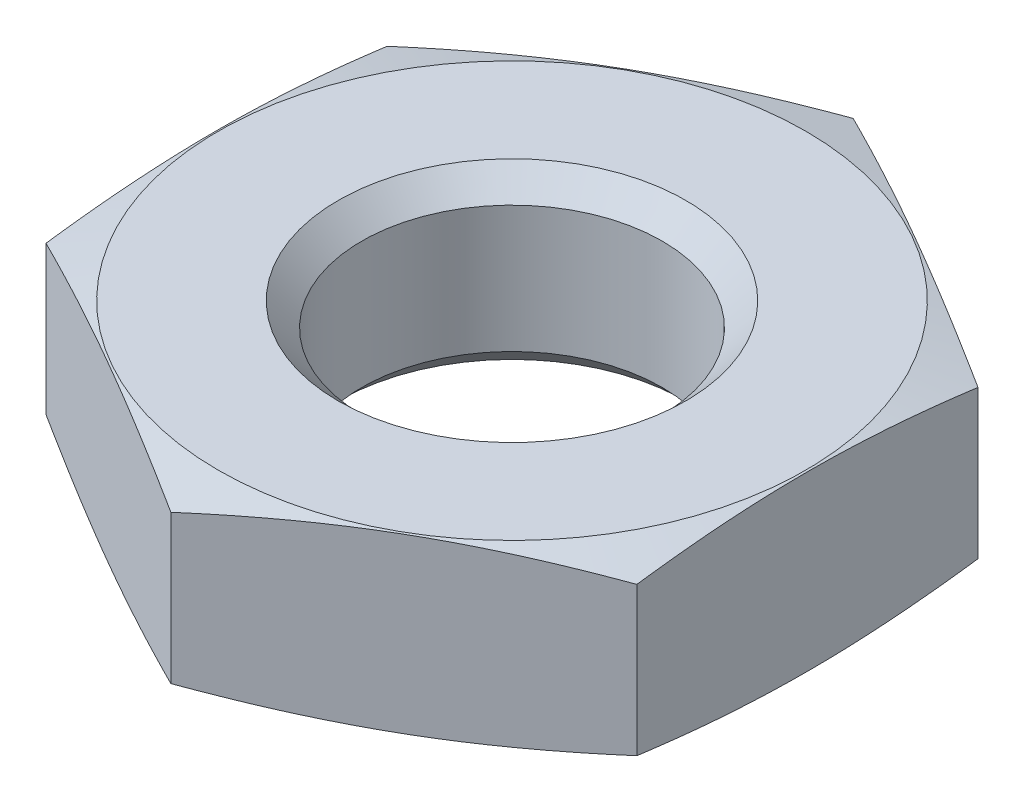
ISO-10303-21;
HEADER;
FILE_DESCRIPTION(('STEP AP214'),'2;1');
FILE_NAME('part.step','',(''),(''),'','','');
FILE_SCHEMA(('AUTOMOTIVE_DESIGN { 1 0 10303 214 1 1 1 1 }'));
ENDSEC;
DATA;
#1=APPLICATION_CONTEXT('core data for automotive mechanical design processes');
#2=APPLICATION_PROTOCOL_DEFINITION('international standard','automotive_design',2000,#1);
#3=PRODUCT_CONTEXT('',#1,'mechanical');
#4=PRODUCT('Part','Part','',(#3));
#5=PRODUCT_RELATED_PRODUCT_CATEGORY('part','',(#4));
#6=PRODUCT_DEFINITION_FORMATION('','',#4);
#7=PRODUCT_DEFINITION_CONTEXT('part definition',#1,'design');
#8=PRODUCT_DEFINITION('design','',#6,#7);
#9=PRODUCT_DEFINITION_SHAPE('','',#8);
#10=(LENGTH_UNIT() NAMED_UNIT(*) SI_UNIT(.MILLI.,.METRE.));
#11=(NAMED_UNIT(*) PLANE_ANGLE_UNIT() SI_UNIT($,.RADIAN.));
#12=(NAMED_UNIT(*) SI_UNIT($,.STERADIAN.) SOLID_ANGLE_UNIT());
#13=UNCERTAINTY_MEASURE_WITH_UNIT(LENGTH_MEASURE(1.E-05),#10,'distance_accuracy_value','');
#14=(GEOMETRIC_REPRESENTATION_CONTEXT(3) GLOBAL_UNCERTAINTY_ASSIGNED_CONTEXT((#13)) GLOBAL_UNIT_ASSIGNED_CONTEXT((#10,
#11,#12)) REPRESENTATION_CONTEXT('',''));
#15=CARTESIAN_POINT('',(0.,0.,0.));
#16=DIRECTION('',(0.,0.,1.));
#17=DIRECTION('',(1.,0.,0.));
#18=AXIS2_PLACEMENT_3D('',#15,#16,#17);
#19=CARTESIAN_POINT('',(0.,0.,0.));
#20=DIRECTION('',(0.,1.,0.));
#21=DIRECTION('',(0.,0.,1.));
#22=AXIS2_PLACEMENT_3D('',#19,#20,#21);
#23=PLANE('',#22);
#24=CARTESIAN_POINT('',(0.,0.,0.));
#25=DIRECTION('',(0.,-1.,0.));
#26=DIRECTION('',(0.,0.,-1.));
#27=AXIS2_PLACEMENT_3D('',#24,#25,#26);
#28=CIRCLE('',#27,8.45);
#29=CARTESIAN_POINT('',(0.,0.,-8.45));
#30=VERTEX_POINT('',#29);
#31=EDGE_CURVE('E117',#30,#30,#28,.T.);
#32=ORIENTED_EDGE('',*,*,#31,.F.);
#33=EDGE_LOOP('',(#32));
#34=FACE_BOUND('',#33,.T.);
#35=CARTESIAN_POINT('',(0.,0.,0.));
#36=DIRECTION('',(0.,1.,0.));
#37=DIRECTION('',(0.,0.,1.));
#38=AXIS2_PLACEMENT_3D('',#35,#36,#37);
#39=CIRCLE('',#38,5.);
#40=CARTESIAN_POINT('',(0.,0.,5.));
#41=VERTEX_POINT('',#40);
#42=EDGE_CURVE('E108',#41,#41,#39,.T.);
#43=ORIENTED_EDGE('',*,*,#42,.F.);
#44=EDGE_LOOP('',(#43));
#45=FACE_BOUND('',#44,.T.);
#46=ADVANCED_FACE('F39',(#34,#45),#23,.T.);
#47=CARTESIAN_POINT('',(8.45,-5.,0.));
#48=DIRECTION('',(0.,-1.,0.));
#49=DIRECTION('',(0.,0.,-1.));
#50=AXIS2_PLACEMENT_3D('',#47,#48,#49);
#51=PLANE('',#50);
#52=CARTESIAN_POINT('',(0.,-5.,0.));
#53=DIRECTION('',(0.,-1.,0.));
#54=DIRECTION('',(0.,0.,-1.));
#55=AXIS2_PLACEMENT_3D('',#52,#53,#54);
#56=CIRCLE('',#55,8.45);
#57=CARTESIAN_POINT('',(0.,-5.,-8.45));
#58=VERTEX_POINT('',#57);
#59=EDGE_CURVE('E114',#58,#58,#56,.T.);
#60=ORIENTED_EDGE('',*,*,#59,.T.);
#61=EDGE_LOOP('',(#60));
#62=FACE_BOUND('',#61,.T.);
#63=CARTESIAN_POINT('',(0.,-5.,0.));
#64=DIRECTION('',(0.,1.,0.));
#65=DIRECTION('',(0.,0.,1.));
#66=AXIS2_PLACEMENT_3D('',#63,#64,#65);
#67=CIRCLE('',#66,5.);
#68=CARTESIAN_POINT('',(0.,-5.,5.));
#69=VERTEX_POINT('',#68);
#70=EDGE_CURVE('E351',#69,#69,#67,.T.);
#71=ORIENTED_EDGE('',*,*,#70,.T.);
#72=EDGE_LOOP('',(#71));
#73=FACE_BOUND('',#72,.T.);
#74=ADVANCED_FACE('F140',(#62,#73),#51,.T.);
#75=CARTESIAN_POINT('',(0.,-2.5,0.));
#76=DIRECTION('',(0.,-1.,0.));
#77=DIRECTION('',(0.,0.,-1.));
#78=AXIS2_PLACEMENT_3D('',#75,#76,#77);
#79=CONICAL_SURFACE('',#78,17.780127018922,1.30899693899574);
#80=ORIENTED_EDGE('',*,*,#31,.T.);
#81=EDGE_LOOP('',(#80));
#82=FACE_BOUND('',#81,.T.);
#83=CARTESIAN_POINT('',(0.000200000000000109,-0.365769417057959,-9.81507004627744));
#84=CARTESIAN_POINT('',(-0.352800229244585,-0.311137500905046,-9.61126526889908));
#85=CARTESIAN_POINT('',(-0.706440481475503,-0.261540764749273,-9.40709097407727));
#86=CARTESIAN_POINT('',(-1.41496987394528,-0.174403984325089,-8.99802133860609));
#87=CARTESIAN_POINT('',(-1.76985946244938,-0.136868837078632,-8.79312573915065));
#88=CARTESIAN_POINT('',(-2.47873586595203,-0.0760464794968255,-8.38385575676622));
#89=CARTESIAN_POINT('',(-2.83271788769515,-0.052686737057327,-8.17948414122454));
#90=CARTESIAN_POINT('',(-3.5411333400369,-0.0213637164939934,-7.77048028911695));
#91=CARTESIAN_POINT('',(-3.89556667001845,-0.0133974596215508,-7.56584811064232));
#92=CARTESIAN_POINT('',(-4.60443332998155,-0.0133974596215514,-7.15658375369308));
#93=CARTESIAN_POINT('',(-4.9588666599631,-0.0213637164939946,-6.95195157521845));
#94=CARTESIAN_POINT('',(-5.66728211230485,-0.0526867370573296,-6.54294772311086));
#95=CARTESIAN_POINT('',(-6.02126413404797,-0.0760464794968291,-6.33857610756918));
#96=CARTESIAN_POINT('',(-6.73014053755062,-0.136868837078638,-5.92930612518475));
#97=CARTESIAN_POINT('',(-7.08503012605472,-0.174403984325095,-5.72441052572931));
#98=CARTESIAN_POINT('',(-7.7935595185245,-0.261540764749279,-5.31534089025813));
#99=CARTESIAN_POINT('',(-8.14719977075542,-0.311137500905053,-5.11116659543632));
#100=CARTESIAN_POINT('',(-8.5002,-0.365769417057967,-4.90736181805796));
#101=B_SPLINE_CURVE_WITH_KNOTS('',3,(#83,#84,#85,#86,#87,#88,#89,#90,#91,#92,#93,#94,#95,#96,
#97,#98,#99,#100),.UNSPECIFIED.,.F.,.F.,(4,2,2,2,2,2,2,2,4),(0.,1.23382789118024,
2.46815608714628,3.69611406802288,4.92383440651826,6.15155474501363,7.37951272589024,
8.61384092185627,9.84766881303652),.UNSPECIFIED.);
#102=CARTESIAN_POINT('',(0.,-0.365738476404288,-9.8149545762236));
#103=VERTEX_POINT('',#102);
#104=CARTESIAN_POINT('',(-8.5,-0.365738476404295,-4.9074772881118));
#105=VERTEX_POINT('',#104);
#106=EDGE_CURVE('E113',#103,#105,#101,.T.);
#107=ORIENTED_EDGE('',*,*,#106,.T.);
#108=CARTESIAN_POINT('',(-8.5,-1.92642057191936,-13.1279832069699));
#109=CARTESIAN_POINT('',(-8.5,-1.83932127039215,-12.7406349627928));
#110=CARTESIAN_POINT('',(-8.5,-1.75326313058208,-12.3530484269744));
#111=CARTESIAN_POINT('',(-8.5,-1.58379149249922,-11.5772814069431));
#112=CARTESIAN_POINT('',(-8.5,-1.50037810420664,-11.1891008987321));
#113=CARTESIAN_POINT('',(-8.5,-1.3366903515689,-10.4117032751554));
#114=CARTESIAN_POINT('',(-8.5,-1.25641894582379,-10.0224855346576));
#115=CARTESIAN_POINT('',(-8.5,-1.09985817949638,-9.24325039368678));
#116=CARTESIAN_POINT('',(-8.5,-1.02356878672485,-8.85323299970434));
#117=CARTESIAN_POINT('',(-8.5,-0.876524124657855,-8.07543379182125));
#118=CARTESIAN_POINT('',(-8.5,-0.805728924453521,-7.68765956341263));
#119=CARTESIAN_POINT('',(-8.5,-0.670160326874121,-6.91106168286053));
#120=CARTESIAN_POINT('',(-8.5,-0.605386800774996,-6.52223805333282));
#121=CARTESIAN_POINT('',(-8.5,-0.483288587260527,-5.74344691623876));
#122=CARTESIAN_POINT('',(-8.5,-0.42596326612889,-5.35347950887936));
#123=CARTESIAN_POINT('',(-8.5,-0.320424034978083,-4.57229948547122));
#124=CARTESIAN_POINT('',(-8.5,-0.272210139770865,-4.18108686739926));
#125=CARTESIAN_POINT('',(-8.5,-0.186225246794287,-3.3929323997467));
#126=CARTESIAN_POINT('',(-8.5,-0.148581086952084,-2.99597650647439));
#127=CARTESIAN_POINT('',(-8.5,-0.0863139460261884,-2.20103578128623));
#128=CARTESIAN_POINT('',(-8.5,-0.0616906658174756,-1.80305097321843));
#129=CARTESIAN_POINT('',(-8.5,-0.0268993237588915,-1.00663700438687));
#130=CARTESIAN_POINT('',(-8.5,-0.0167240195305037,-0.608208166517941));
#131=CARTESIAN_POINT('',(-8.5,-0.011457285477952,0.188750322461922));
#132=CARTESIAN_POINT('',(-8.5,-0.0163658185702185,0.587279973322593));
#133=CARTESIAN_POINT('',(-8.5,-0.0409950485271136,1.3854137735139));
#134=CARTESIAN_POINT('',(-8.5,-0.0607729249063426,1.78501612193593));
#135=CARTESIAN_POINT('',(-8.5,-0.114002371250342,2.58330073591768));
#136=CARTESIAN_POINT('',(-8.5,-0.147454253888863,2.98198298022839));
#137=CARTESIAN_POINT('',(-8.5,-0.226306196483209,3.77842454632211));
#138=CARTESIAN_POINT('',(-8.5,-0.271714524278714,4.17618303657969));
#139=CARTESIAN_POINT('',(-8.5,-0.372545066577098,4.9704134430476));
#140=CARTESIAN_POINT('',(-8.5,-0.42796729990405,5.36688535683801));
#141=CARTESIAN_POINT('',(-8.5,-0.547442372972131,6.1614729547726));
#142=CARTESIAN_POINT('',(-8.5,-0.611555227721372,6.55957952897368));
#143=CARTESIAN_POINT('',(-8.5,-0.746490800225996,7.35466005530148));
#144=CARTESIAN_POINT('',(-8.5,-0.817313756750398,7.75163396660592));
#145=CARTESIAN_POINT('',(-8.5,-0.964353313780116,8.54462981261712));
#146=CARTESIAN_POINT('',(-8.5,-1.04057061760528,8.94065161620165));
#147=CARTESIAN_POINT('',(-8.5,-1.19733071862897,9.73182971463512));
#148=CARTESIAN_POINT('',(-8.5,-1.27787346384562,10.126986019826));
#149=CARTESIAN_POINT('',(-8.5,-1.44247635736502,10.9167036970875));
#150=CARTESIAN_POINT('',(-8.5,-1.52653769503571,11.3112648205117));
#151=CARTESIAN_POINT('',(-8.5,-1.69750119150697,12.0997720715462));
#152=CARTESIAN_POINT('',(-8.5,-1.78440336805737,12.4937181952977));
#153=CARTESIAN_POINT('',(-8.5,-2.04855360742352,13.6747155802632));
#154=CARTESIAN_POINT('',(-8.5,-2.22925956303744,14.4609929465206));
#155=CARTESIAN_POINT('',(-8.5,-2.5949504237304,16.0234783302383));
#156=CARTESIAN_POINT('',(-8.5,-2.77986695499727,16.799702458533));
#157=CARTESIAN_POINT('',(-8.5,-3.15409907473815,18.3511068496893));
#158=CARTESIAN_POINT('',(-8.5,-3.34341476494822,19.1262870879702));
#159=CARTESIAN_POINT('',(-8.5,-3.72496969885712,20.6747326729913));
#160=CARTESIAN_POINT('',(-8.5,-3.91720430146404,21.4479991661323));
#161=CARTESIAN_POINT('',(-8.5,-4.30411124409256,22.9938918833236));
#162=CARTESIAN_POINT('',(-8.5,-4.49878349312805,23.7665181301303));
#163=CARTESIAN_POINT('',(-8.5,-4.69430497268749,24.5389270311885));
#164=B_SPLINE_CURVE_WITH_KNOTS('',3,(#108,#109,#110,#111,#112,#113,#114,#115,#116,#117,#118,
#119,#120,#121,#122,#123,#124,#125,#126,#127,#128,#129,#130,#131,#132,#133,#134,#135,#136,#137,
#138,#139,#140,#141,#142,#143,#144,#145,#146,#147,#148,#149,#150,#151,#152,#153,#154,#155,#156,
#157,#158,#159,#160,#161,#162,#163),.UNSPECIFIED.,.F.,.F.,(4,2,2,2,2,2,2,2,2,2,2,2,2,2,2,2,2,2,
2,2,2,2,2,2,2,2,2,4),(0.,1.19106493134707,2.38217932753959,3.57438958404474,4.76659020163769,
5.949103509723,7.13159153365494,8.31397888187624,9.49636815222418,10.6923925935517,
11.8883895577511,13.0837867892026,14.2791810817759,15.4791958828865,16.679238125415,
17.8801123821845,19.0809888963729,20.2906264404375,21.5003070438373,22.710145658064,
23.9199697360651,25.1302061191678,26.3404500653845,28.7607322503598,31.154555788,
33.5484347410171,35.9388398790336,38.3291560586371),.UNSPECIFIED.);
#165=CARTESIAN_POINT('',(-8.5,-0.365738476404295,4.9074772881118));
#166=VERTEX_POINT('',#165);
#167=EDGE_CURVE('E105',#105,#166,#164,.T.);
#168=ORIENTED_EDGE('',*,*,#167,.T.);
#169=CARTESIAN_POINT('',(-8.5002,-0.365769417057967,4.90736181805796));
#170=CARTESIAN_POINT('',(-8.14719977075542,-0.311137500905053,5.11116659543632));
#171=CARTESIAN_POINT('',(-7.7935595185245,-0.261540764749279,5.31534089025813));
#172=CARTESIAN_POINT('',(-7.08503012605472,-0.174403984325094,5.72441052572931));
#173=CARTESIAN_POINT('',(-6.73014053755062,-0.136868837078637,5.92930612518475));
#174=CARTESIAN_POINT('',(-6.02126413404797,-0.0760464794968289,6.33857610756918));
#175=CARTESIAN_POINT('',(-5.66728211230485,-0.05268673705733,6.54294772311086));
#176=CARTESIAN_POINT('',(-4.9588666599631,-0.0213637164939952,6.95195157521845));
#177=CARTESIAN_POINT('',(-4.60443332998155,-0.0133974596215518,7.15658375369308));
#178=CARTESIAN_POINT('',(-3.89556667001845,-0.0133974596215507,7.56584811064232));
#179=CARTESIAN_POINT('',(-3.5411333400369,-0.021363716493993,7.77048028911695));
#180=CARTESIAN_POINT('',(-2.83271788769515,-0.0526867370573266,8.17948414122455));
#181=CARTESIAN_POINT('',(-2.47873586595203,-0.0760464794968255,8.38385575676622));
#182=CARTESIAN_POINT('',(-1.76985946244938,-0.136868837078633,8.79312573915065));
#183=CARTESIAN_POINT('',(-1.41496987394528,-0.174403984325089,8.99802133860609));
#184=CARTESIAN_POINT('',(-0.7064404814755,-0.261540764749272,9.40709097407727));
#185=CARTESIAN_POINT('',(-0.352800229244583,-0.311137500905045,9.61126526889908));
#186=CARTESIAN_POINT('',(0.000200000000002859,-0.36576941705796,9.81507004627744));
#187=B_SPLINE_CURVE_WITH_KNOTS('',3,(#169,#170,#171,#172,#173,#174,#175,#176,#177,#178,#179,
#180,#181,#182,#183,#184,#185,#186),.UNSPECIFIED.,.F.,.F.,(4,2,2,2,2,2,2,2,4),(0.,
1.23382789118024,2.46815608714628,3.69611406802288,4.92383440651826,6.15155474501364,
7.37951272589024,8.61384092185628,9.84766881303652),.UNSPECIFIED.);
#188=CARTESIAN_POINT('',(0.,-0.365738476404288,9.8149545762236));
#189=VERTEX_POINT('',#188);
#190=EDGE_CURVE('E94',#166,#189,#187,.T.);
#191=ORIENTED_EDGE('',*,*,#190,.T.);
#192=CARTESIAN_POINT('',(-0.000200000000000109,-0.365769417057959,9.81507004627744));
#193=CARTESIAN_POINT('',(0.352800229244585,-0.311137500905046,9.61126526889908));
#194=CARTESIAN_POINT('',(0.706440481475503,-0.261540764749273,9.40709097407727));
#195=CARTESIAN_POINT('',(1.41496987394528,-0.174403984325089,8.99802133860609));
#196=CARTESIAN_POINT('',(1.76985946244938,-0.136868837078632,8.79312573915065));
#197=CARTESIAN_POINT('',(2.47873586595203,-0.0760464794968255,8.38385575676622));
#198=CARTESIAN_POINT('',(2.83271788769515,-0.052686737057327,8.17948414122454));
#199=CARTESIAN_POINT('',(3.5411333400369,-0.0213637164939934,7.77048028911695));
#200=CARTESIAN_POINT('',(3.89556667001845,-0.0133974596215508,7.56584811064232));
#201=CARTESIAN_POINT('',(4.60443332998155,-0.0133974596215514,7.15658375369308));
#202=CARTESIAN_POINT('',(4.9588666599631,-0.0213637164939946,6.95195157521845));
#203=CARTESIAN_POINT('',(5.66728211230485,-0.0526867370573296,6.54294772311086));
#204=CARTESIAN_POINT('',(6.02126413404797,-0.0760464794968291,6.33857610756918));
#205=CARTESIAN_POINT('',(6.73014053755062,-0.136868837078638,5.92930612518475));
#206=CARTESIAN_POINT('',(7.08503012605472,-0.174403984325095,5.72441052572931));
#207=CARTESIAN_POINT('',(7.7935595185245,-0.261540764749279,5.31534089025813));
#208=CARTESIAN_POINT('',(8.14719977075542,-0.311137500905053,5.11116659543632));
#209=CARTESIAN_POINT('',(8.5002,-0.365769417057967,4.90736181805796));
#210=B_SPLINE_CURVE_WITH_KNOTS('',3,(#192,#193,#194,#195,#196,#197,#198,#199,#200,#201,#202,
#203,#204,#205,#206,#207,#208,#209),.UNSPECIFIED.,.F.,.F.,(4,2,2,2,2,2,2,2,4),(0.,
1.23382789118024,2.46815608714628,3.69611406802288,4.92383440651826,6.15155474501363,
7.37951272589024,8.61384092185627,9.84766881303652),.UNSPECIFIED.);
#211=CARTESIAN_POINT('',(8.5,-0.365738476404295,4.9074772881118));
#212=VERTEX_POINT('',#211);
#213=EDGE_CURVE('E99',#189,#212,#210,.T.);
#214=ORIENTED_EDGE('',*,*,#213,.T.);
#215=CARTESIAN_POINT('',(8.5,-1.92642057191936,-13.1279832069699));
#216=CARTESIAN_POINT('',(8.5,-1.83932127039215,-12.7406349627928));
#217=CARTESIAN_POINT('',(8.5,-1.75326313058208,-12.3530484269744));
#218=CARTESIAN_POINT('',(8.5,-1.58379149249922,-11.5772814069431));
#219=CARTESIAN_POINT('',(8.5,-1.50037810420664,-11.1891008987321));
#220=CARTESIAN_POINT('',(8.5,-1.3366903515689,-10.4117032751554));
#221=CARTESIAN_POINT('',(8.5,-1.25641894582379,-10.0224855346576));
#222=CARTESIAN_POINT('',(8.5,-1.09985817949638,-9.24325039368678));
#223=CARTESIAN_POINT('',(8.5,-1.02356878672485,-8.85323299970434));
#224=CARTESIAN_POINT('',(8.5,-0.876524124657855,-8.07543379182125));
#225=CARTESIAN_POINT('',(8.5,-0.805728924453521,-7.68765956341263));
#226=CARTESIAN_POINT('',(8.5,-0.670160326874121,-6.91106168286053));
#227=CARTESIAN_POINT('',(8.5,-0.605386800774996,-6.52223805333282));
#228=CARTESIAN_POINT('',(8.5,-0.483288587260527,-5.74344691623876));
#229=CARTESIAN_POINT('',(8.5,-0.42596326612889,-5.35347950887936));
#230=CARTESIAN_POINT('',(8.5,-0.320424034978083,-4.57229948547122));
#231=CARTESIAN_POINT('',(8.5,-0.272210139770865,-4.18108686739926));
#232=CARTESIAN_POINT('',(8.5,-0.186225246794287,-3.3929323997467));
#233=CARTESIAN_POINT('',(8.5,-0.148581086952084,-2.99597650647439));
#234=CARTESIAN_POINT('',(8.5,-0.0863139460261884,-2.20103578128623));
#235=CARTESIAN_POINT('',(8.5,-0.0616906658174756,-1.80305097321843));
#236=CARTESIAN_POINT('',(8.5,-0.0268993237588915,-1.00663700438687));
#237=CARTESIAN_POINT('',(8.5,-0.0167240195305037,-0.608208166517941));
#238=CARTESIAN_POINT('',(8.5,-0.011457285477952,0.188750322461922));
#239=CARTESIAN_POINT('',(8.5,-0.0163658185702185,0.587279973322593));
#240=CARTESIAN_POINT('',(8.5,-0.0409950485271136,1.3854137735139));
#241=CARTESIAN_POINT('',(8.5,-0.0607729249063426,1.78501612193593));
#242=CARTESIAN_POINT('',(8.5,-0.114002371250342,2.58330073591768));
#243=CARTESIAN_POINT('',(8.5,-0.147454253888863,2.98198298022839));
#244=CARTESIAN_POINT('',(8.5,-0.226306196483209,3.77842454632211));
#245=CARTESIAN_POINT('',(8.5,-0.271714524278714,4.17618303657969));
#246=CARTESIAN_POINT('',(8.5,-0.372545066577098,4.9704134430476));
#247=CARTESIAN_POINT('',(8.5,-0.42796729990405,5.36688535683801));
#248=CARTESIAN_POINT('',(8.5,-0.547442372972131,6.1614729547726));
#249=CARTESIAN_POINT('',(8.5,-0.611555227721372,6.55957952897368));
#250=CARTESIAN_POINT('',(8.5,-0.746490800225996,7.35466005530148));
#251=CARTESIAN_POINT('',(8.5,-0.817313756750398,7.75163396660592));
#252=CARTESIAN_POINT('',(8.5,-0.964353313780116,8.54462981261712));
#253=CARTESIAN_POINT('',(8.5,-1.04057061760528,8.94065161620165));
#254=CARTESIAN_POINT('',(8.5,-1.19733071862897,9.73182971463512));
#255=CARTESIAN_POINT('',(8.5,-1.27787346384562,10.126986019826));
#256=CARTESIAN_POINT('',(8.5,-1.44247635736502,10.9167036970875));
#257=CARTESIAN_POINT('',(8.5,-1.52653769503571,11.3112648205117));
#258=CARTESIAN_POINT('',(8.5,-1.69750119150697,12.0997720715462));
#259=CARTESIAN_POINT('',(8.5,-1.78440336805737,12.4937181952977));
#260=CARTESIAN_POINT('',(8.5,-2.04855360742352,13.6747155802632));
#261=CARTESIAN_POINT('',(8.5,-2.22925956303744,14.4609929465206));
#262=CARTESIAN_POINT('',(8.5,-2.5949504237304,16.0234783302383));
#263=CARTESIAN_POINT('',(8.5,-2.77986695499727,16.799702458533));
#264=CARTESIAN_POINT('',(8.5,-3.15409907473815,18.3511068496893));
#265=CARTESIAN_POINT('',(8.5,-3.34341476494822,19.1262870879702));
#266=CARTESIAN_POINT('',(8.5,-3.72496969885712,20.6747326729913));
#267=CARTESIAN_POINT('',(8.5,-3.91720430146404,21.4479991661323));
#268=CARTESIAN_POINT('',(8.5,-4.30411124409256,22.9938918833236));
#269=CARTESIAN_POINT('',(8.5,-4.49878349312805,23.7665181301303));
#270=CARTESIAN_POINT('',(8.5,-4.69430497268749,24.5389270311885));
#271=B_SPLINE_CURVE_WITH_KNOTS('',3,(#215,#216,#217,#218,#219,#220,#221,#222,#223,#224,#225,
#226,#227,#228,#229,#230,#231,#232,#233,#234,#235,#236,#237,#238,#239,#240,#241,#242,#243,#244,
#245,#246,#247,#248,#249,#250,#251,#252,#253,#254,#255,#256,#257,#258,#259,#260,#261,#262,#263,
#264,#265,#266,#267,#268,#269,#270),.UNSPECIFIED.,.F.,.F.,(4,2,2,2,2,2,2,2,2,2,2,2,2,2,2,2,2,2,
2,2,2,2,2,2,2,2,2,4),(0.,1.19106493134707,2.38217932753959,3.57438958404474,4.76659020163769,
5.949103509723,7.13159153365494,8.31397888187624,9.49636815222418,10.6923925935517,
11.8883895577511,13.0837867892026,14.2791810817759,15.4791958828865,16.679238125415,
17.8801123821845,19.0809888963729,20.2906264404375,21.5003070438373,22.710145658064,
23.9199697360651,25.1302061191678,26.3404500653845,28.7607322503598,31.154555788,
33.5484347410171,35.9388398790336,38.3291560586371),.UNSPECIFIED.);
#272=CARTESIAN_POINT('',(8.5,-0.365738476404295,-4.9074772881118));
#273=VERTEX_POINT('',#272);
#274=EDGE_CURVE('E203',#212,#273,#271,.F.);
#275=ORIENTED_EDGE('',*,*,#274,.T.);
#276=CARTESIAN_POINT('',(8.5002,-0.365769417057967,-4.90736181805796));
#277=CARTESIAN_POINT('',(8.14719977075542,-0.311137500905053,-5.11116659543632));
#278=CARTESIAN_POINT('',(7.7935595185245,-0.261540764749279,-5.31534089025813));
#279=CARTESIAN_POINT('',(7.08503012605472,-0.174403984325094,-5.72441052572931));
#280=CARTESIAN_POINT('',(6.73014053755062,-0.136868837078637,-5.92930612518475));
#281=CARTESIAN_POINT('',(6.02126413404797,-0.0760464794968289,-6.33857610756918));
#282=CARTESIAN_POINT('',(5.66728211230485,-0.05268673705733,-6.54294772311086));
#283=CARTESIAN_POINT('',(4.9588666599631,-0.0213637164939952,-6.95195157521845));
#284=CARTESIAN_POINT('',(4.60443332998155,-0.0133974596215518,-7.15658375369308));
#285=CARTESIAN_POINT('',(3.89556667001845,-0.0133974596215507,-7.56584811064232));
#286=CARTESIAN_POINT('',(3.5411333400369,-0.021363716493993,-7.77048028911695));
#287=CARTESIAN_POINT('',(2.83271788769515,-0.0526867370573266,-8.17948414122455));
#288=CARTESIAN_POINT('',(2.47873586595203,-0.0760464794968255,-8.38385575676622));
#289=CARTESIAN_POINT('',(1.76985946244938,-0.136868837078633,-8.79312573915065));
#290=CARTESIAN_POINT('',(1.41496987394528,-0.174403984325089,-8.99802133860609));
#291=CARTESIAN_POINT('',(0.7064404814755,-0.261540764749272,-9.40709097407727));
#292=CARTESIAN_POINT('',(0.352800229244583,-0.311137500905045,-9.61126526889908));
#293=CARTESIAN_POINT('',(-0.000200000000002859,-0.36576941705796,-9.81507004627744));
#294=B_SPLINE_CURVE_WITH_KNOTS('',3,(#276,#277,#278,#279,#280,#281,#282,#283,#284,#285,#286,
#287,#288,#289,#290,#291,#292,#293),.UNSPECIFIED.,.F.,.F.,(4,2,2,2,2,2,2,2,4),(0.,
1.23382789118024,2.46815608714628,3.69611406802288,4.92383440651826,6.15155474501364,
7.37951272589024,8.61384092185628,9.84766881303652),.UNSPECIFIED.);
#295=EDGE_CURVE('E119',#273,#103,#294,.T.);
#296=ORIENTED_EDGE('',*,*,#295,.T.);
#297=EDGE_LOOP('',(#107,#168,#191,#214,#275,#296));
#298=FACE_BOUND('',#297,.T.);
#299=ADVANCED_FACE('F111',(#82,#298),#79,.T.);
#300=CARTESIAN_POINT('',(-8.5,-6.,-4.9074772881118));
#301=DIRECTION('',(-1.,0.,0.));
#302=DIRECTION('',(0.,0.,1.));
#303=AXIS2_PLACEMENT_3D('',#300,#301,#302);
#304=PLANE('',#303);
#305=DIRECTION('',(0.,1.,0.));
#306=VECTOR('',#305,1.);
#307=CARTESIAN_POINT('',(-8.5,-6.,-4.9074772881118));
#308=LINE('',#307,#306);
#309=CARTESIAN_POINT('',(-8.5,-4.63426152359571,-4.9074772881118));
#310=VERTEX_POINT('',#309);
#311=EDGE_CURVE('E100',#310,#105,#308,.T.);
#312=ORIENTED_EDGE('',*,*,#311,.F.);
#313=CARTESIAN_POINT('',(-8.5,-3.07357942808064,-13.1279832069699));
#314=CARTESIAN_POINT('',(-8.5,-3.16067872960785,-12.7406349627928));
#315=CARTESIAN_POINT('',(-8.5,-3.24673686941793,-12.3530484269744));
#316=CARTESIAN_POINT('',(-8.5,-3.41620850750078,-11.5772814069431));
#317=CARTESIAN_POINT('',(-8.5,-3.49962189579336,-11.1891008987321));
#318=CARTESIAN_POINT('',(-8.5,-3.6633096484311,-10.4117032751554));
#319=CARTESIAN_POINT('',(-8.5,-3.74358105417621,-10.0224855346576));
#320=CARTESIAN_POINT('',(-8.5,-3.90014182050362,-9.24325039368678));
#321=CARTESIAN_POINT('',(-8.5,-3.97643121327515,-8.85323299970434));
#322=CARTESIAN_POINT('',(-8.5,-4.12347587534215,-8.07543379182125));
#323=CARTESIAN_POINT('',(-8.5,-4.19427107554648,-7.68765956341263));
#324=CARTESIAN_POINT('',(-8.5,-4.32983967312588,-6.91106168286054));
#325=CARTESIAN_POINT('',(-8.5,-4.39461319922501,-6.52223805333282));
#326=CARTESIAN_POINT('',(-8.5,-4.51671141273947,-5.74344691623877));
#327=CARTESIAN_POINT('',(-8.5,-4.57403673387111,-5.35347950887936));
#328=CARTESIAN_POINT('',(-8.5,-4.67957596502192,-4.57229948547122));
#329=CARTESIAN_POINT('',(-8.5,-4.72778986022914,-4.18108686739926));
#330=CARTESIAN_POINT('',(-8.5,-4.81377475320571,-3.3929323997467));
#331=CARTESIAN_POINT('',(-8.5,-4.85141891304792,-2.99597650647439));
#332=CARTESIAN_POINT('',(-8.5,-4.91368605397381,-2.20103578128623));
#333=CARTESIAN_POINT('',(-8.5,-4.93830933418252,-1.80305097321843));
#334=CARTESIAN_POINT('',(-8.5,-4.97310067624111,-1.00663700438687));
#335=CARTESIAN_POINT('',(-8.5,-4.9832759804695,-0.60820816651794));
#336=CARTESIAN_POINT('',(-8.5,-4.98854271452205,0.188750322461923));
#337=CARTESIAN_POINT('',(-8.5,-4.98363418142978,0.587279973322595));
#338=CARTESIAN_POINT('',(-8.5,-4.95900495147289,1.3854137735139));
#339=CARTESIAN_POINT('',(-8.5,-4.93922707509366,1.78501612193593));
#340=CARTESIAN_POINT('',(-8.5,-4.88599762874966,2.58330073591768));
#341=CARTESIAN_POINT('',(-8.5,-4.85254574611114,2.98198298022839));
#342=CARTESIAN_POINT('',(-8.5,-4.77369380351679,3.77842454632211));
#343=CARTESIAN_POINT('',(-8.5,-4.72828547572129,4.17618303657969));
#344=CARTESIAN_POINT('',(-8.5,-4.6274549334229,4.9704134430476));
#345=CARTESIAN_POINT('',(-8.5,-4.57203270009595,5.36688535683801));
#346=CARTESIAN_POINT('',(-8.5,-4.45255762702787,6.1614729547726));
#347=CARTESIAN_POINT('',(-8.5,-4.38844477227863,6.55957952897368));
#348=CARTESIAN_POINT('',(-8.5,-4.25350919977401,7.35466005530148));
#349=CARTESIAN_POINT('',(-8.5,-4.1826862432496,7.75163396660592));
#350=CARTESIAN_POINT('',(-8.5,-4.03564668621989,8.54462981261712));
#351=CARTESIAN_POINT('',(-8.5,-3.95942938239472,8.94065161620165));
#352=CARTESIAN_POINT('',(-8.5,-3.80266928137104,9.73182971463512));
#353=CARTESIAN_POINT('',(-8.5,-3.72212653615438,10.126986019826));
#354=CARTESIAN_POINT('',(-8.5,-3.55752364263498,10.9167036970875));
#355=CARTESIAN_POINT('',(-8.5,-3.4734623049643,11.3112648205117));
#356=CARTESIAN_POINT('',(-8.5,-3.30249880849304,12.0997720715462));
#357=CARTESIAN_POINT('',(-8.5,-3.21559663194264,12.4937181952977));
#358=CARTESIAN_POINT('',(-8.5,-2.95144639257648,13.6747155802632));
#359=CARTESIAN_POINT('',(-8.5,-2.77074043696256,14.4609929465206));
#360=CARTESIAN_POINT('',(-8.5,-2.4050495762696,16.0234783302383));
#361=CARTESIAN_POINT('',(-8.5,-2.22013304500273,16.799702458533));
#362=CARTESIAN_POINT('',(-8.5,-1.84590092526185,18.3511068496893));
#363=CARTESIAN_POINT('',(-8.5,-1.65658523505178,19.1262870879702));
#364=CARTESIAN_POINT('',(-8.5,-1.27503030114288,20.6747326729913));
#365=CARTESIAN_POINT('',(-8.5,-1.08279569853596,21.4479991661323));
#366=CARTESIAN_POINT('',(-8.5,-0.695888755907443,22.9938918833236));
#367=CARTESIAN_POINT('',(-8.5,-0.50121650687195,23.7665181301303));
#368=CARTESIAN_POINT('',(-8.5,-0.305695027312507,24.5389270311885));
#369=B_SPLINE_CURVE_WITH_KNOTS('',3,(#313,#314,#315,#316,#317,#318,#319,#320,#321,#322,#323,
#324,#325,#326,#327,#328,#329,#330,#331,#332,#333,#334,#335,#336,#337,#338,#339,#340,#341,#342,
#343,#344,#345,#346,#347,#348,#349,#350,#351,#352,#353,#354,#355,#356,#357,#358,#359,#360,#361,
#362,#363,#364,#365,#366,#367,#368),.UNSPECIFIED.,.F.,.F.,(4,2,2,2,2,2,2,2,2,2,2,2,2,2,2,2,2,2,
2,2,2,2,2,2,2,2,2,4),(0.,1.19106493134707,2.38217932753959,3.57438958404474,4.76659020163769,
5.94910350972299,7.13159153365494,8.31397888187624,9.49636815222418,10.6923925935517,
11.8883895577511,13.0837867892026,14.2791810817759,15.4791958828865,16.679238125415,
17.8801123821845,19.0809888963729,20.2906264404375,21.5003070438373,22.710145658064,
23.9199697360651,25.1302061191678,26.3404500653845,28.7607322503598,31.154555788,
33.548434741017,35.9388398790336,38.3291560586371),.UNSPECIFIED.);
#370=CARTESIAN_POINT('',(-8.5,-4.63426152359571,4.9074772881118));
#371=VERTEX_POINT('',#370);
#372=EDGE_CURVE('E11',#371,#310,#369,.F.);
#373=ORIENTED_EDGE('',*,*,#372,.F.);
#374=DIRECTION('',(0.,1.,0.));
#375=VECTOR('',#374,1.);
#376=CARTESIAN_POINT('',(-8.5,-6.,4.9074772881118));
#377=LINE('',#376,#375);
#378=EDGE_CURVE('E64',#371,#166,#377,.T.);
#379=ORIENTED_EDGE('',*,*,#378,.T.);
#380=ORIENTED_EDGE('',*,*,#167,.F.);
#381=EDGE_LOOP('',(#312,#373,#379,#380));
#382=FACE_BOUND('',#381,.T.);
#383=ADVANCED_FACE('F104',(#382),#304,.T.);
#384=CARTESIAN_POINT('',(0.,-6.,-9.8149545762236));
#385=DIRECTION('',(-0.499999999999999,0.,-0.866025403784439));
#386=DIRECTION('',(-0.866025403784439,0.,0.499999999999999));
#387=AXIS2_PLACEMENT_3D('',#384,#385,#386);
#388=PLANE('',#387);
#389=DIRECTION('',(0.,1.,0.));
#390=VECTOR('',#389,1.);
#391=CARTESIAN_POINT('',(0.,-6.,-9.8149545762236));
#392=LINE('',#391,#390);
#393=CARTESIAN_POINT('',(0.,-4.63426152359571,-9.8149545762236));
#394=VERTEX_POINT('',#393);
#395=EDGE_CURVE('E246',#394,#103,#392,.T.);
#396=ORIENTED_EDGE('',*,*,#395,.F.);
#397=CARTESIAN_POINT('',(-8.5002,-4.63423058294203,-4.90736181805796));
#398=CARTESIAN_POINT('',(-8.14719977075542,-4.68886249909495,-5.11116659543632));
#399=CARTESIAN_POINT('',(-7.7935595185245,-4.73845923525072,-5.31534089025813));
#400=CARTESIAN_POINT('',(-7.08503012605472,-4.82559601567491,-5.72441052572931));
#401=CARTESIAN_POINT('',(-6.73014053755062,-4.86313116292136,-5.92930612518475));
#402=CARTESIAN_POINT('',(-6.02126413404797,-4.92395352050317,-6.33857610756918));
#403=CARTESIAN_POINT('',(-5.66728211230485,-4.94731326294267,-6.54294772311086));
#404=CARTESIAN_POINT('',(-4.9588666599631,-4.97863628350601,-6.95195157521845));
#405=CARTESIAN_POINT('',(-4.60443332998155,-4.98660254037845,-7.15658375369308));
#406=CARTESIAN_POINT('',(-3.89556667001845,-4.98660254037845,-7.56584811064232));
#407=CARTESIAN_POINT('',(-3.5411333400369,-4.97863628350601,-7.77048028911695));
#408=CARTESIAN_POINT('',(-2.83271788769515,-4.94731326294267,-8.17948414122454));
#409=CARTESIAN_POINT('',(-2.47873586595203,-4.92395352050318,-8.38385575676622));
#410=CARTESIAN_POINT('',(-1.76985946244938,-4.86313116292137,-8.79312573915065));
#411=CARTESIAN_POINT('',(-1.41496987394528,-4.82559601567491,-8.99802133860609));
#412=CARTESIAN_POINT('',(-0.706440481475501,-4.73845923525073,-9.40709097407727));
#413=CARTESIAN_POINT('',(-0.352800229244584,-4.68886249909496,-9.61126526889908));
#414=CARTESIAN_POINT('',(0.00020000000000279,-4.63423058294204,-9.81507004627744));
#415=B_SPLINE_CURVE_WITH_KNOTS('',3,(#397,#398,#399,#400,#401,#402,#403,#404,#405,#406,#407,
#408,#409,#410,#411,#412,#413,#414),.UNSPECIFIED.,.F.,.F.,(4,2,2,2,2,2,2,2,4),(0.,
1.23382789118024,2.46815608714628,3.69611406802288,4.92383440651826,6.15155474501364,
7.37951272589024,8.61384092185628,9.84766881303652),.UNSPECIFIED.);
#416=EDGE_CURVE('E52',#310,#394,#415,.T.);
#417=ORIENTED_EDGE('',*,*,#416,.F.);
#418=ORIENTED_EDGE('',*,*,#311,.T.);
#419=ORIENTED_EDGE('',*,*,#106,.F.);
#420=EDGE_LOOP('',(#396,#417,#418,#419));
#421=FACE_BOUND('',#420,.T.);
#422=ADVANCED_FACE('F137',(#421),#388,.T.);
#423=CARTESIAN_POINT('',(8.5,-6.,-4.9074772881118));
#424=DIRECTION('',(0.499999999999999,0.,-0.866025403784439));
#425=DIRECTION('',(-0.866025403784439,0.,-0.499999999999999));
#426=AXIS2_PLACEMENT_3D('',#423,#424,#425);
#427=PLANE('',#426);
#428=DIRECTION('',(0.,1.,0.));
#429=VECTOR('',#428,1.);
#430=CARTESIAN_POINT('',(8.5,-6.,-4.9074772881118));
#431=LINE('',#430,#429);
#432=CARTESIAN_POINT('',(8.5,-4.63426152359571,-4.9074772881118));
#433=VERTEX_POINT('',#432);
#434=EDGE_CURVE('E249',#433,#273,#431,.T.);
#435=ORIENTED_EDGE('',*,*,#434,.F.);
#436=CARTESIAN_POINT('',(-0.0002,-4.63423058294204,-9.81507004627744));
#437=CARTESIAN_POINT('',(0.352800229244586,-4.68886249909496,-9.61126526889908));
#438=CARTESIAN_POINT('',(0.706440481475503,-4.73845923525073,-9.40709097407727));
#439=CARTESIAN_POINT('',(1.41496987394528,-4.82559601567491,-8.99802133860609));
#440=CARTESIAN_POINT('',(1.76985946244938,-4.86313116292137,-8.79312573915065));
#441=CARTESIAN_POINT('',(2.47873586595203,-4.92395352050318,-8.38385575676622));
#442=CARTESIAN_POINT('',(2.83271788769515,-4.94731326294268,-8.17948414122454));
#443=CARTESIAN_POINT('',(3.5411333400369,-4.97863628350601,-7.77048028911695));
#444=CARTESIAN_POINT('',(3.89556667001845,-4.98660254037845,-7.56584811064232));
#445=CARTESIAN_POINT('',(4.60443332998155,-4.98660254037845,-7.15658375369308));
#446=CARTESIAN_POINT('',(4.9588666599631,-4.97863628350601,-6.95195157521845));
#447=CARTESIAN_POINT('',(5.66728211230485,-4.94731326294267,-6.54294772311086));
#448=CARTESIAN_POINT('',(6.02126413404797,-4.92395352050317,-6.33857610756918));
#449=CARTESIAN_POINT('',(6.73014053755062,-4.86313116292136,-5.92930612518475));
#450=CARTESIAN_POINT('',(7.08503012605472,-4.82559601567491,-5.72441052572931));
#451=CARTESIAN_POINT('',(7.7935595185245,-4.73845923525072,-5.31534089025813));
#452=CARTESIAN_POINT('',(8.14719977075542,-4.68886249909495,-5.11116659543632));
#453=CARTESIAN_POINT('',(8.5002,-4.63423058294203,-4.90736181805796));
#454=B_SPLINE_CURVE_WITH_KNOTS('',3,(#436,#437,#438,#439,#440,#441,#442,#443,#444,#445,#446,
#447,#448,#449,#450,#451,#452,#453),.UNSPECIFIED.,.F.,.F.,(4,2,2,2,2,2,2,2,4),(0.,
1.23382789118024,2.46815608714628,3.69611406802288,4.92383440651826,6.15155474501364,
7.37951272589024,8.61384092185627,9.84766881303652),.UNSPECIFIED.);
#455=EDGE_CURVE('E174',#394,#433,#454,.T.);
#456=ORIENTED_EDGE('',*,*,#455,.F.);
#457=ORIENTED_EDGE('',*,*,#395,.T.);
#458=ORIENTED_EDGE('',*,*,#295,.F.);
#459=EDGE_LOOP('',(#435,#456,#457,#458));
#460=FACE_BOUND('',#459,.T.);
#461=ADVANCED_FACE('F188',(#460),#427,.T.);
#462=CARTESIAN_POINT('',(8.5,-6.,4.9074772881118));
#463=DIRECTION('',(1.,0.,0.));
#464=DIRECTION('',(0.,0.,-1.));
#465=AXIS2_PLACEMENT_3D('',#462,#463,#464);
#466=PLANE('',#465);
#467=DIRECTION('',(0.,1.,0.));
#468=VECTOR('',#467,1.);
#469=CARTESIAN_POINT('',(8.5,-6.,4.9074772881118));
#470=LINE('',#469,#468);
#471=CARTESIAN_POINT('',(8.5,-4.63426152359571,4.9074772881118));
#472=VERTEX_POINT('',#471);
#473=EDGE_CURVE('E252',#472,#212,#470,.T.);
#474=ORIENTED_EDGE('',*,*,#473,.F.);
#475=CARTESIAN_POINT('',(8.5,-3.07357942808064,-13.1279832069699));
#476=CARTESIAN_POINT('',(8.5,-3.16067872960785,-12.7406349627928));
#477=CARTESIAN_POINT('',(8.5,-3.24673686941793,-12.3530484269744));
#478=CARTESIAN_POINT('',(8.5,-3.41620850750078,-11.5772814069431));
#479=CARTESIAN_POINT('',(8.5,-3.49962189579336,-11.1891008987321));
#480=CARTESIAN_POINT('',(8.5,-3.6633096484311,-10.4117032751554));
#481=CARTESIAN_POINT('',(8.5,-3.74358105417621,-10.0224855346576));
#482=CARTESIAN_POINT('',(8.5,-3.90014182050362,-9.24325039368678));
#483=CARTESIAN_POINT('',(8.5,-3.97643121327515,-8.85323299970434));
#484=CARTESIAN_POINT('',(8.5,-4.12347587534215,-8.07543379182125));
#485=CARTESIAN_POINT('',(8.5,-4.19427107554648,-7.68765956341263));
#486=CARTESIAN_POINT('',(8.5,-4.32983967312588,-6.91106168286054));
#487=CARTESIAN_POINT('',(8.5,-4.39461319922501,-6.52223805333282));
#488=CARTESIAN_POINT('',(8.5,-4.51671141273947,-5.74344691623877));
#489=CARTESIAN_POINT('',(8.5,-4.57403673387111,-5.35347950887936));
#490=CARTESIAN_POINT('',(8.5,-4.67957596502192,-4.57229948547122));
#491=CARTESIAN_POINT('',(8.5,-4.72778986022914,-4.18108686739926));
#492=CARTESIAN_POINT('',(8.5,-4.81377475320571,-3.3929323997467));
#493=CARTESIAN_POINT('',(8.5,-4.85141891304792,-2.99597650647439));
#494=CARTESIAN_POINT('',(8.5,-4.91368605397381,-2.20103578128623));
#495=CARTESIAN_POINT('',(8.5,-4.93830933418252,-1.80305097321843));
#496=CARTESIAN_POINT('',(8.5,-4.97310067624111,-1.00663700438687));
#497=CARTESIAN_POINT('',(8.5,-4.9832759804695,-0.60820816651794));
#498=CARTESIAN_POINT('',(8.5,-4.98854271452205,0.188750322461923));
#499=CARTESIAN_POINT('',(8.5,-4.98363418142978,0.587279973322595));
#500=CARTESIAN_POINT('',(8.5,-4.95900495147289,1.3854137735139));
#501=CARTESIAN_POINT('',(8.5,-4.93922707509366,1.78501612193593));
#502=CARTESIAN_POINT('',(8.5,-4.88599762874966,2.58330073591768));
#503=CARTESIAN_POINT('',(8.5,-4.85254574611114,2.98198298022839));
#504=CARTESIAN_POINT('',(8.5,-4.77369380351679,3.77842454632211));
#505=CARTESIAN_POINT('',(8.5,-4.72828547572129,4.17618303657969));
#506=CARTESIAN_POINT('',(8.5,-4.6274549334229,4.9704134430476));
#507=CARTESIAN_POINT('',(8.5,-4.57203270009595,5.36688535683801));
#508=CARTESIAN_POINT('',(8.5,-4.45255762702787,6.1614729547726));
#509=CARTESIAN_POINT('',(8.5,-4.38844477227863,6.55957952897368));
#510=CARTESIAN_POINT('',(8.5,-4.25350919977401,7.35466005530148));
#511=CARTESIAN_POINT('',(8.5,-4.1826862432496,7.75163396660592));
#512=CARTESIAN_POINT('',(8.5,-4.03564668621989,8.54462981261712));
#513=CARTESIAN_POINT('',(8.5,-3.95942938239472,8.94065161620165));
#514=CARTESIAN_POINT('',(8.5,-3.80266928137104,9.73182971463512));
#515=CARTESIAN_POINT('',(8.5,-3.72212653615438,10.126986019826));
#516=CARTESIAN_POINT('',(8.5,-3.55752364263498,10.9167036970875));
#517=CARTESIAN_POINT('',(8.5,-3.4734623049643,11.3112648205117));
#518=CARTESIAN_POINT('',(8.5,-3.30249880849304,12.0997720715462));
#519=CARTESIAN_POINT('',(8.5,-3.21559663194264,12.4937181952977));
#520=CARTESIAN_POINT('',(8.5,-2.95144639257648,13.6747155802632));
#521=CARTESIAN_POINT('',(8.5,-2.77074043696256,14.4609929465206));
#522=CARTESIAN_POINT('',(8.5,-2.4050495762696,16.0234783302383));
#523=CARTESIAN_POINT('',(8.5,-2.22013304500273,16.799702458533));
#524=CARTESIAN_POINT('',(8.5,-1.84590092526185,18.3511068496893));
#525=CARTESIAN_POINT('',(8.5,-1.65658523505178,19.1262870879702));
#526=CARTESIAN_POINT('',(8.5,-1.27503030114288,20.6747326729913));
#527=CARTESIAN_POINT('',(8.5,-1.08279569853596,21.4479991661323));
#528=CARTESIAN_POINT('',(8.5,-0.695888755907443,22.9938918833236));
#529=CARTESIAN_POINT('',(8.5,-0.50121650687195,23.7665181301303));
#530=CARTESIAN_POINT('',(8.5,-0.305695027312507,24.5389270311885));
#531=B_SPLINE_CURVE_WITH_KNOTS('',3,(#475,#476,#477,#478,#479,#480,#481,#482,#483,#484,#485,
#486,#487,#488,#489,#490,#491,#492,#493,#494,#495,#496,#497,#498,#499,#500,#501,#502,#503,#504,
#505,#506,#507,#508,#509,#510,#511,#512,#513,#514,#515,#516,#517,#518,#519,#520,#521,#522,#523,
#524,#525,#526,#527,#528,#529,#530),.UNSPECIFIED.,.F.,.F.,(4,2,2,2,2,2,2,2,2,2,2,2,2,2,2,2,2,2,
2,2,2,2,2,2,2,2,2,4),(0.,1.19106493134707,2.38217932753959,3.57438958404474,4.76659020163769,
5.94910350972299,7.13159153365494,8.31397888187624,9.49636815222418,10.6923925935517,
11.8883895577511,13.0837867892026,14.2791810817759,15.4791958828865,16.679238125415,
17.8801123821845,19.0809888963729,20.2906264404375,21.5003070438373,22.710145658064,
23.9199697360651,25.1302061191678,26.3404500653845,28.7607322503598,31.154555788,
33.548434741017,35.9388398790336,38.3291560586371),.UNSPECIFIED.);
#532=EDGE_CURVE('E167',#433,#472,#531,.T.);
#533=ORIENTED_EDGE('',*,*,#532,.F.);
#534=ORIENTED_EDGE('',*,*,#434,.T.);
#535=ORIENTED_EDGE('',*,*,#274,.F.);
#536=EDGE_LOOP('',(#474,#533,#534,#535));
#537=FACE_BOUND('',#536,.T.);
#538=ADVANCED_FACE('F194',(#537),#466,.T.);
#539=CARTESIAN_POINT('',(0.,-6.,9.8149545762236));
#540=DIRECTION('',(0.499999999999999,0.,0.866025403784439));
#541=DIRECTION('',(0.866025403784439,0.,-0.499999999999999));
#542=AXIS2_PLACEMENT_3D('',#539,#540,#541);
#543=PLANE('',#542);
#544=DIRECTION('',(0.,1.,0.));
#545=VECTOR('',#544,1.);
#546=CARTESIAN_POINT('',(0.,-6.,9.8149545762236));
#547=LINE('',#546,#545);
#548=CARTESIAN_POINT('',(0.,-4.63426152359571,9.8149545762236));
#549=VERTEX_POINT('',#548);
#550=EDGE_CURVE('E59',#549,#189,#547,.T.);
#551=ORIENTED_EDGE('',*,*,#550,.F.);
#552=CARTESIAN_POINT('',(8.5002,-4.63423058294203,4.90736181805796));
#553=CARTESIAN_POINT('',(8.14719977075542,-4.68886249909495,5.11116659543632));
#554=CARTESIAN_POINT('',(7.7935595185245,-4.73845923525072,5.31534089025813));
#555=CARTESIAN_POINT('',(7.08503012605472,-4.82559601567491,5.72441052572931));
#556=CARTESIAN_POINT('',(6.73014053755062,-4.86313116292136,5.92930612518475));
#557=CARTESIAN_POINT('',(6.02126413404797,-4.92395352050317,6.33857610756918));
#558=CARTESIAN_POINT('',(5.66728211230485,-4.94731326294267,6.54294772311086));
#559=CARTESIAN_POINT('',(4.9588666599631,-4.97863628350601,6.95195157521845));
#560=CARTESIAN_POINT('',(4.60443332998155,-4.98660254037845,7.15658375369308));
#561=CARTESIAN_POINT('',(3.89556667001845,-4.98660254037845,7.56584811064232));
#562=CARTESIAN_POINT('',(3.5411333400369,-4.97863628350601,7.77048028911695));
#563=CARTESIAN_POINT('',(2.83271788769515,-4.94731326294267,8.17948414122454));
#564=CARTESIAN_POINT('',(2.47873586595203,-4.92395352050318,8.38385575676622));
#565=CARTESIAN_POINT('',(1.76985946244938,-4.86313116292137,8.79312573915065));
#566=CARTESIAN_POINT('',(1.41496987394528,-4.82559601567491,8.99802133860609));
#567=CARTESIAN_POINT('',(0.706440481475501,-4.73845923525073,9.40709097407727));
#568=CARTESIAN_POINT('',(0.352800229244584,-4.68886249909496,9.61126526889908));
#569=CARTESIAN_POINT('',(-0.00020000000000279,-4.63423058294204,9.81507004627744));
#570=B_SPLINE_CURVE_WITH_KNOTS('',3,(#552,#553,#554,#555,#556,#557,#558,#559,#560,#561,#562,
#563,#564,#565,#566,#567,#568,#569),.UNSPECIFIED.,.F.,.F.,(4,2,2,2,2,2,2,2,4),(0.,
1.23382789118024,2.46815608714628,3.69611406802288,4.92383440651826,6.15155474501364,
7.37951272589024,8.61384092185628,9.84766881303652),.UNSPECIFIED.);
#571=EDGE_CURVE('E160',#472,#549,#570,.T.);
#572=ORIENTED_EDGE('',*,*,#571,.F.);
#573=ORIENTED_EDGE('',*,*,#473,.T.);
#574=ORIENTED_EDGE('',*,*,#213,.F.);
#575=EDGE_LOOP('',(#551,#572,#573,#574));
#576=FACE_BOUND('',#575,.T.);
#577=ADVANCED_FACE('F218',(#576),#543,.T.);
#578=CARTESIAN_POINT('',(-8.5,-6.,4.9074772881118));
#579=DIRECTION('',(-0.499999999999999,0.,0.866025403784439));
#580=DIRECTION('',(0.866025403784439,0.,0.499999999999999));
#581=AXIS2_PLACEMENT_3D('',#578,#579,#580);
#582=PLANE('',#581);
#583=ORIENTED_EDGE('',*,*,#378,.F.);
#584=CARTESIAN_POINT('',(0.0002,-4.63423058294204,9.81507004627744));
#585=CARTESIAN_POINT('',(-0.352800229244586,-4.68886249909496,9.61126526889908));
#586=CARTESIAN_POINT('',(-0.706440481475503,-4.73845923525073,9.40709097407727));
#587=CARTESIAN_POINT('',(-1.41496987394528,-4.82559601567491,8.99802133860609));
#588=CARTESIAN_POINT('',(-1.76985946244938,-4.86313116292137,8.79312573915065));
#589=CARTESIAN_POINT('',(-2.47873586595203,-4.92395352050318,8.38385575676622));
#590=CARTESIAN_POINT('',(-2.83271788769515,-4.94731326294268,8.17948414122454));
#591=CARTESIAN_POINT('',(-3.5411333400369,-4.97863628350601,7.77048028911695));
#592=CARTESIAN_POINT('',(-3.89556667001845,-4.98660254037845,7.56584811064232));
#593=CARTESIAN_POINT('',(-4.60443332998155,-4.98660254037845,7.15658375369308));
#594=CARTESIAN_POINT('',(-4.9588666599631,-4.97863628350601,6.95195157521845));
#595=CARTESIAN_POINT('',(-5.66728211230485,-4.94731326294267,6.54294772311086));
#596=CARTESIAN_POINT('',(-6.02126413404797,-4.92395352050317,6.33857610756918));
#597=CARTESIAN_POINT('',(-6.73014053755062,-4.86313116292136,5.92930612518475));
#598=CARTESIAN_POINT('',(-7.08503012605472,-4.82559601567491,5.72441052572931));
#599=CARTESIAN_POINT('',(-7.7935595185245,-4.73845923525072,5.31534089025813));
#600=CARTESIAN_POINT('',(-8.14719977075542,-4.68886249909495,5.11116659543632));
#601=CARTESIAN_POINT('',(-8.5002,-4.63423058294203,4.90736181805796));
#602=B_SPLINE_CURVE_WITH_KNOTS('',3,(#584,#585,#586,#587,#588,#589,#590,#591,#592,#593,#594,
#595,#596,#597,#598,#599,#600,#601),.UNSPECIFIED.,.F.,.F.,(4,2,2,2,2,2,2,2,4),(0.,
1.23382789118024,2.46815608714628,3.69611406802288,4.92383440651826,6.15155474501364,
7.37951272589024,8.61384092185627,9.84766881303652),.UNSPECIFIED.);
#603=EDGE_CURVE('E152',#549,#371,#602,.T.);
#604=ORIENTED_EDGE('',*,*,#603,.F.);
#605=ORIENTED_EDGE('',*,*,#550,.T.);
#606=ORIENTED_EDGE('',*,*,#190,.F.);
#607=EDGE_LOOP('',(#583,#604,#605,#606));
#608=FACE_BOUND('',#607,.T.);
#609=ADVANCED_FACE('F95',(#608),#582,.T.);
#610=CARTESIAN_POINT('',(0.,-5.,0.));
#611=DIRECTION('',(0.,1.,0.));
#612=DIRECTION('',(0.,0.,1.));
#613=AXIS2_PLACEMENT_3D('',#610,#611,#612);
#614=CONICAL_SURFACE('',#613,8.45,1.30899693899574);
#615=ORIENTED_EDGE('',*,*,#59,.F.);
#616=EDGE_LOOP('',(#615));
#617=FACE_BOUND('',#616,.T.);
#618=ORIENTED_EDGE('',*,*,#603,.T.);
#619=ORIENTED_EDGE('',*,*,#372,.T.);
#620=ORIENTED_EDGE('',*,*,#416,.T.);
#621=ORIENTED_EDGE('',*,*,#455,.T.);
#622=ORIENTED_EDGE('',*,*,#532,.T.);
#623=ORIENTED_EDGE('',*,*,#571,.T.);
#624=EDGE_LOOP('',(#618,#619,#620,#621,#622,#623));
#625=FACE_BOUND('',#624,.T.);
#626=ADVANCED_FACE('F144',(#617,#625),#614,.T.);
#627=CARTESIAN_POINT('',(0.,-0.6765,0.));
#628=DIRECTION('',(0.,1.,0.));
#629=DIRECTION('',(0.,0.,1.));
#630=AXIS2_PLACEMENT_3D('',#627,#628,#629);
#631=CONICAL_SURFACE('',#630,4.3235,0.785398163397448);
#632=ORIENTED_EDGE('',*,*,#42,.T.);
#633=EDGE_LOOP('',(#632));
#634=FACE_BOUND('',#633,.T.);
#635=CARTESIAN_POINT('',(0.,-0.6765,0.));
#636=DIRECTION('',(0.,1.,0.));
#637=DIRECTION('',(0.,0.,1.));
#638=AXIS2_PLACEMENT_3D('',#635,#636,#637);
#639=CIRCLE('',#638,4.3235);
#640=CARTESIAN_POINT('',(0.,-0.6765,4.3235));
#641=VERTEX_POINT('',#640);
#642=EDGE_CURVE('E238',#641,#641,#639,.T.);
#643=ORIENTED_EDGE('',*,*,#642,.F.);
#644=EDGE_LOOP('',(#643));
#645=FACE_BOUND('',#644,.T.);
#646=ADVANCED_FACE('F147',(#634,#645),#631,.F.);
#647=CARTESIAN_POINT('',(0.,-5.,0.));
#648=DIRECTION('',(0.,1.,0.));
#649=DIRECTION('',(0.,0.,1.));
#650=AXIS2_PLACEMENT_3D('',#647,#648,#649);
#651=CYLINDRICAL_SURFACE('',#650,4.3235);
#652=ORIENTED_EDGE('',*,*,#642,.T.);
#653=EDGE_LOOP('',(#652));
#654=FACE_BOUND('',#653,.T.);
#655=CARTESIAN_POINT('',(0.,-4.3235,0.));
#656=DIRECTION('',(0.,1.,0.));
#657=DIRECTION('',(0.,0.,1.));
#658=AXIS2_PLACEMENT_3D('',#655,#656,#657);
#659=CIRCLE('',#658,4.3235);
#660=CARTESIAN_POINT('',(0.,-4.3235,4.3235));
#661=VERTEX_POINT('',#660);
#662=EDGE_CURVE('E241',#661,#661,#659,.T.);
#663=ORIENTED_EDGE('',*,*,#662,.F.);
#664=EDGE_LOOP('',(#663));
#665=FACE_BOUND('',#664,.T.);
#666=ADVANCED_FACE('F301',(#654,#665),#651,.F.);
#667=CARTESIAN_POINT('',(0.,-5.,0.));
#668=DIRECTION('',(0.,-1.,0.));
#669=DIRECTION('',(0.,0.,-1.));
#670=AXIS2_PLACEMENT_3D('',#667,#668,#669);
#671=CONICAL_SURFACE('',#670,5.,0.785398163397448);
#672=ORIENTED_EDGE('',*,*,#662,.T.);
#673=EDGE_LOOP('',(#672));
#674=FACE_BOUND('',#673,.T.);
#675=ORIENTED_EDGE('',*,*,#70,.F.);
#676=EDGE_LOOP('',(#675));
#677=FACE_BOUND('',#676,.T.);
#678=ADVANCED_FACE('F305',(#674,#677),#671,.F.);
#679=CLOSED_SHELL('',(#46,#74,#299,#383,#422,#461,#538,#577,#609,#626,#646,#666,#678));
#680=MANIFOLD_SOLID_BREP('B2',#679);
#681=ADVANCED_BREP_SHAPE_REPRESENTATION('',(#18,#680),#14);
#682=SHAPE_DEFINITION_REPRESENTATION(#9,#681);
ENDSEC;
END-ISO-10303-21;
